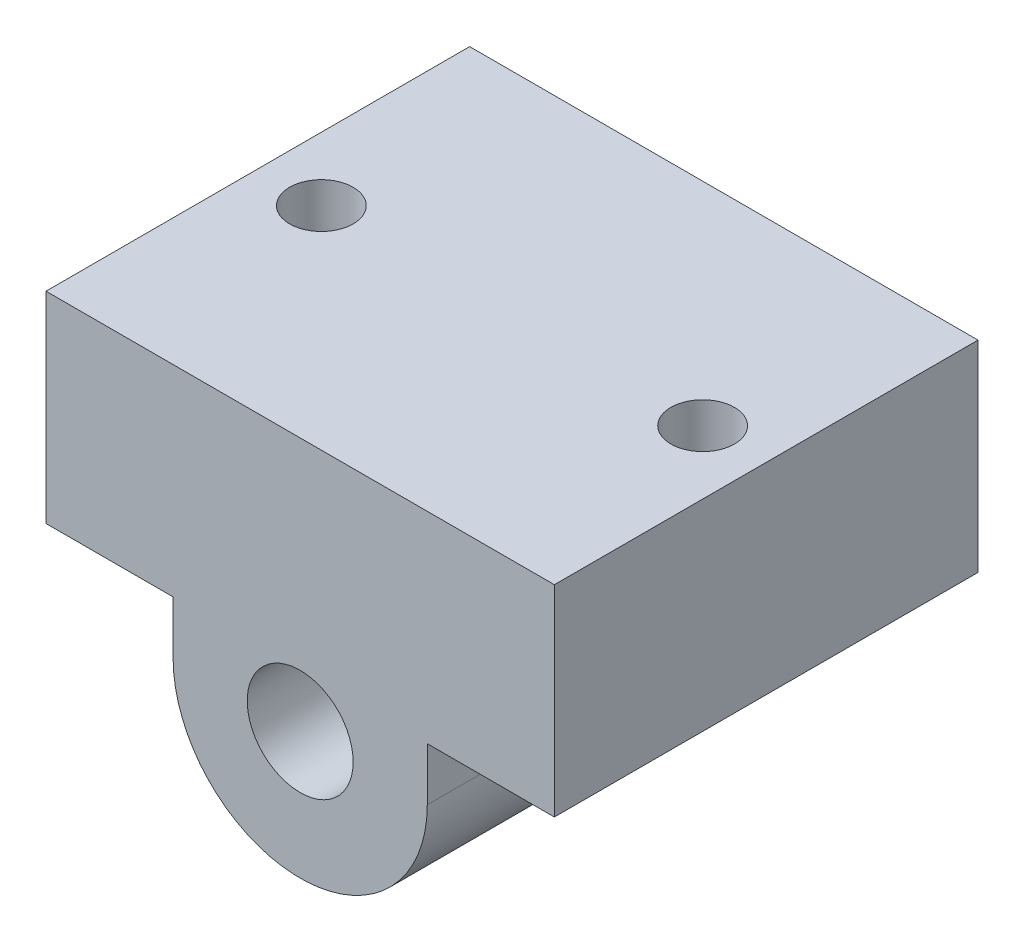
ISO-10303-21;
HEADER;
FILE_DESCRIPTION(('STEP AP214'),'2;1');
FILE_NAME('part.step','',(''),(''),'','','');
FILE_SCHEMA(('AUTOMOTIVE_DESIGN { 1 0 10303 214 1 1 1 1 }'));
ENDSEC;
DATA;
#1=APPLICATION_CONTEXT('core data for automotive mechanical design processes');
#2=APPLICATION_PROTOCOL_DEFINITION('international standard','automotive_design',2000,#1);
#3=PRODUCT_CONTEXT('',#1,'mechanical');
#4=PRODUCT('Part','Part','',(#3));
#5=PRODUCT_RELATED_PRODUCT_CATEGORY('part','',(#4));
#6=PRODUCT_DEFINITION_FORMATION('','',#4);
#7=PRODUCT_DEFINITION_CONTEXT('part definition',#1,'design');
#8=PRODUCT_DEFINITION('design','',#6,#7);
#9=PRODUCT_DEFINITION_SHAPE('','',#8);
#10=(LENGTH_UNIT() NAMED_UNIT(*) SI_UNIT(.MILLI.,.METRE.));
#11=(NAMED_UNIT(*) PLANE_ANGLE_UNIT() SI_UNIT($,.RADIAN.));
#12=(NAMED_UNIT(*) SI_UNIT($,.STERADIAN.) SOLID_ANGLE_UNIT());
#13=UNCERTAINTY_MEASURE_WITH_UNIT(LENGTH_MEASURE(1.E-05),#10,'distance_accuracy_value','');
#14=(GEOMETRIC_REPRESENTATION_CONTEXT(3) GLOBAL_UNCERTAINTY_ASSIGNED_CONTEXT((#13)) GLOBAL_UNIT_ASSIGNED_CONTEXT((#10,
#11,#12)) REPRESENTATION_CONTEXT('',''));
#15=CARTESIAN_POINT('',(0.,0.,0.));
#16=DIRECTION('',(0.,0.,1.));
#17=DIRECTION('',(1.,0.,0.));
#18=AXIS2_PLACEMENT_3D('',#15,#16,#17);
#19=CARTESIAN_POINT('',(0.,12.,-20.));
#20=DIRECTION('',(0.,-1.,0.));
#21=DIRECTION('',(0.,0.,-1.));
#22=AXIS2_PLACEMENT_3D('',#19,#20,#21);
#23=PLANE('',#22);
#24=CARTESIAN_POINT('',(-9.,12.,-10.));
#25=DIRECTION('',(0.,-1.,0.));
#26=DIRECTION('',(0.,0.,-1.));
#27=AXIS2_PLACEMENT_3D('',#24,#25,#26);
#28=CIRCLE('',#27,1.5);
#29=CARTESIAN_POINT('',(-9.,12.,-11.5));
#30=VERTEX_POINT('',#29);
#31=EDGE_CURVE('E199',#30,#30,#28,.T.);
#32=ORIENTED_EDGE('',*,*,#31,.T.);
#33=EDGE_LOOP('',(#32));
#34=FACE_BOUND('',#33,.T.);
#35=CARTESIAN_POINT('',(9.,12.,-10.));
#36=DIRECTION('',(0.,-1.,0.));
#37=DIRECTION('',(0.,0.,-1.));
#38=AXIS2_PLACEMENT_3D('',#35,#36,#37);
#39=CIRCLE('',#38,1.5);
#40=CARTESIAN_POINT('',(9.,12.,-11.5));
#41=VERTEX_POINT('',#40);
#42=EDGE_CURVE('E196',#41,#41,#39,.T.);
#43=ORIENTED_EDGE('',*,*,#42,.T.);
#44=EDGE_LOOP('',(#43));
#45=FACE_BOUND('',#44,.T.);
#46=DIRECTION('',(1.,0.,0.));
#47=VECTOR('',#46,1.);
#48=CARTESIAN_POINT('',(0.,12.,0.));
#49=LINE('',#48,#47);
#50=CARTESIAN_POINT('',(-12.,12.,0.));
#51=VERTEX_POINT('',#50);
#52=CARTESIAN_POINT('',(12.,12.,0.));
#53=VERTEX_POINT('',#52);
#54=EDGE_CURVE('E172',#51,#53,#49,.T.);
#55=ORIENTED_EDGE('',*,*,#54,.T.);
#56=DIRECTION('',(0.,0.,1.));
#57=VECTOR('',#56,1.);
#58=CARTESIAN_POINT('',(12.,12.,-20.));
#59=LINE('',#58,#57);
#60=CARTESIAN_POINT('',(12.,12.,-20.));
#61=VERTEX_POINT('',#60);
#62=EDGE_CURVE('E148',#61,#53,#59,.T.);
#63=ORIENTED_EDGE('',*,*,#62,.F.);
#64=DIRECTION('',(1.,0.,0.));
#65=VECTOR('',#64,1.);
#66=CARTESIAN_POINT('',(0.,12.,-20.));
#67=LINE('',#66,#65);
#68=CARTESIAN_POINT('',(-12.,12.,-20.));
#69=VERTEX_POINT('',#68);
#70=EDGE_CURVE('E217',#69,#61,#67,.T.);
#71=ORIENTED_EDGE('',*,*,#70,.F.);
#72=DIRECTION('',(0.,0.,1.));
#73=VECTOR('',#72,1.);
#74=CARTESIAN_POINT('',(-12.,12.,-20.));
#75=LINE('',#74,#73);
#76=EDGE_CURVE('E187',#69,#51,#75,.T.);
#77=ORIENTED_EDGE('',*,*,#76,.T.);
#78=EDGE_LOOP('',(#55,#63,#71,#77));
#79=FACE_BOUND('',#78,.T.);
#80=ADVANCED_FACE('F139',(#34,#45,#79),#23,.F.);
#81=CARTESIAN_POINT('',(0.,2.5,-20.));
#82=DIRECTION('',(0.,-1.,0.));
#83=DIRECTION('',(0.,0.,-1.));
#84=AXIS2_PLACEMENT_3D('',#81,#82,#83);
#85=PLANE('',#84);
#86=CARTESIAN_POINT('',(9.,2.5,-10.));
#87=DIRECTION('',(0.,-1.,0.));
#88=DIRECTION('',(0.,0.,-1.));
#89=AXIS2_PLACEMENT_3D('',#86,#87,#88);
#90=CIRCLE('',#89,1.5);
#91=CARTESIAN_POINT('',(9.,2.5,-11.5));
#92=VERTEX_POINT('',#91);
#93=EDGE_CURVE('E260',#92,#92,#90,.T.);
#94=ORIENTED_EDGE('',*,*,#93,.F.);
#95=EDGE_LOOP('',(#94));
#96=FACE_BOUND('',#95,.T.);
#97=DIRECTION('',(1.,0.,0.));
#98=VECTOR('',#97,1.);
#99=CARTESIAN_POINT('',(0.,2.5,0.));
#100=LINE('',#99,#98);
#101=CARTESIAN_POINT('',(6.,2.5,0.));
#102=VERTEX_POINT('',#101);
#103=CARTESIAN_POINT('',(12.,2.5,0.));
#104=VERTEX_POINT('',#103);
#105=EDGE_CURVE('E232',#102,#104,#100,.T.);
#106=ORIENTED_EDGE('',*,*,#105,.F.);
#107=DIRECTION('',(0.,0.,1.));
#108=VECTOR('',#107,1.);
#109=CARTESIAN_POINT('',(6.,2.5,-20.));
#110=LINE('',#109,#108);
#111=CARTESIAN_POINT('',(6.,2.5,-20.));
#112=VERTEX_POINT('',#111);
#113=EDGE_CURVE('E220',#112,#102,#110,.T.);
#114=ORIENTED_EDGE('',*,*,#113,.F.);
#115=DIRECTION('',(1.,0.,0.));
#116=VECTOR('',#115,1.);
#117=CARTESIAN_POINT('',(0.,2.5,-20.));
#118=LINE('',#117,#116);
#119=CARTESIAN_POINT('',(12.,2.5,-20.));
#120=VERTEX_POINT('',#119);
#121=EDGE_CURVE('E247',#112,#120,#118,.T.);
#122=ORIENTED_EDGE('',*,*,#121,.T.);
#123=DIRECTION('',(0.,0.,1.));
#124=VECTOR('',#123,1.);
#125=CARTESIAN_POINT('',(12.,2.5,-20.));
#126=LINE('',#125,#124);
#127=EDGE_CURVE('E223',#120,#104,#126,.T.);
#128=ORIENTED_EDGE('',*,*,#127,.T.);
#129=EDGE_LOOP('',(#106,#114,#122,#128));
#130=FACE_BOUND('',#129,.T.);
#131=ADVANCED_FACE('F280',(#96,#130),#85,.T.);
#132=CARTESIAN_POINT('',(12.,0.,-20.));
#133=DIRECTION('',(1.,0.,0.));
#134=DIRECTION('',(0.,0.,-1.));
#135=AXIS2_PLACEMENT_3D('',#132,#133,#134);
#136=PLANE('',#135);
#137=DIRECTION('',(0.,1.,0.));
#138=VECTOR('',#137,1.);
#139=CARTESIAN_POINT('',(12.,0.,0.));
#140=LINE('',#139,#138);
#141=EDGE_CURVE('E230',#104,#53,#140,.T.);
#142=ORIENTED_EDGE('',*,*,#141,.F.);
#143=ORIENTED_EDGE('',*,*,#127,.F.);
#144=DIRECTION('',(0.,1.,0.));
#145=VECTOR('',#144,1.);
#146=CARTESIAN_POINT('',(12.,0.,-20.));
#147=LINE('',#146,#145);
#148=EDGE_CURVE('E244',#120,#61,#147,.T.);
#149=ORIENTED_EDGE('',*,*,#148,.T.);
#150=ORIENTED_EDGE('',*,*,#62,.T.);
#151=EDGE_LOOP('',(#142,#143,#149,#150));
#152=FACE_BOUND('',#151,.T.);
#153=ADVANCED_FACE('F277',(#152),#136,.T.);
#154=CARTESIAN_POINT('',(6.,0.,-20.));
#155=DIRECTION('',(-1.,0.,0.));
#156=DIRECTION('',(0.,0.,1.));
#157=AXIS2_PLACEMENT_3D('',#154,#155,#156);
#158=PLANE('',#157);
#159=DIRECTION('',(0.,-1.,0.));
#160=VECTOR('',#159,1.);
#161=CARTESIAN_POINT('',(6.,0.,0.));
#162=LINE('',#161,#160);
#163=CARTESIAN_POINT('',(6.,0.,0.));
#164=VERTEX_POINT('',#163);
#165=EDGE_CURVE('E235',#102,#164,#162,.T.);
#166=ORIENTED_EDGE('',*,*,#165,.T.);
#167=DIRECTION('',(0.,0.,1.));
#168=VECTOR('',#167,1.);
#169=CARTESIAN_POINT('',(6.,0.,-20.));
#170=LINE('',#169,#168);
#171=CARTESIAN_POINT('',(6.,0.,-20.));
#172=VERTEX_POINT('',#171);
#173=EDGE_CURVE('E216',#172,#164,#170,.T.);
#174=ORIENTED_EDGE('',*,*,#173,.F.);
#175=DIRECTION('',(0.,-1.,0.));
#176=VECTOR('',#175,1.);
#177=CARTESIAN_POINT('',(6.,0.,-20.));
#178=LINE('',#177,#176);
#179=EDGE_CURVE('E250',#112,#172,#178,.T.);
#180=ORIENTED_EDGE('',*,*,#179,.F.);
#181=ORIENTED_EDGE('',*,*,#113,.T.);
#182=EDGE_LOOP('',(#166,#174,#180,#181));
#183=FACE_BOUND('',#182,.T.);
#184=ADVANCED_FACE('F288',(#183),#158,.F.);
#185=CARTESIAN_POINT('',(0.,0.,-20.));
#186=DIRECTION('',(0.,0.,1.));
#187=DIRECTION('',(1.,0.,0.));
#188=AXIS2_PLACEMENT_3D('',#185,#186,#187);
#189=CYLINDRICAL_SURFACE('',#188,6.);
#190=CARTESIAN_POINT('',(0.,0.,0.));
#191=DIRECTION('',(0.,0.,1.));
#192=DIRECTION('',(1.,0.,0.));
#193=AXIS2_PLACEMENT_3D('',#190,#191,#192);
#194=CIRCLE('',#193,6.);
#195=CARTESIAN_POINT('',(-6.,0.,0.));
#196=VERTEX_POINT('',#195);
#197=EDGE_CURVE('E238',#196,#164,#194,.T.);
#198=ORIENTED_EDGE('',*,*,#197,.F.);
#199=DIRECTION('',(0.,0.,1.));
#200=VECTOR('',#199,1.);
#201=CARTESIAN_POINT('',(-6.,0.,-20.));
#202=LINE('',#201,#200);
#203=CARTESIAN_POINT('',(-6.,0.,-20.));
#204=VERTEX_POINT('',#203);
#205=EDGE_CURVE('E213',#204,#196,#202,.T.);
#206=ORIENTED_EDGE('',*,*,#205,.F.);
#207=CARTESIAN_POINT('',(0.,0.,-20.));
#208=DIRECTION('',(0.,0.,1.));
#209=DIRECTION('',(1.,0.,0.));
#210=AXIS2_PLACEMENT_3D('',#207,#208,#209);
#211=CIRCLE('',#210,6.);
#212=EDGE_CURVE('E253',#204,#172,#211,.T.);
#213=ORIENTED_EDGE('',*,*,#212,.T.);
#214=ORIENTED_EDGE('',*,*,#173,.T.);
#215=EDGE_LOOP('',(#198,#206,#213,#214));
#216=FACE_BOUND('',#215,.T.);
#217=ADVANCED_FACE('F298',(#216),#189,.T.);
#218=CARTESIAN_POINT('',(-6.,0.,-20.));
#219=DIRECTION('',(1.,0.,0.));
#220=DIRECTION('',(0.,0.,-1.));
#221=AXIS2_PLACEMENT_3D('',#218,#219,#220);
#222=PLANE('',#221);
#223=DIRECTION('',(0.,1.,0.));
#224=VECTOR('',#223,1.);
#225=CARTESIAN_POINT('',(-6.,0.,0.));
#226=LINE('',#225,#224);
#227=CARTESIAN_POINT('',(-6.,2.5,0.));
#228=VERTEX_POINT('',#227);
#229=EDGE_CURVE('E212',#196,#228,#226,.T.);
#230=ORIENTED_EDGE('',*,*,#229,.T.);
#231=DIRECTION('',(0.,0.,-1.));
#232=VECTOR('',#231,1.);
#233=CARTESIAN_POINT('',(-6.,2.5,-20.));
#234=LINE('',#233,#232);
#235=CARTESIAN_POINT('',(-6.,2.5,-20.));
#236=VERTEX_POINT('',#235);
#237=EDGE_CURVE('E12',#228,#236,#234,.T.);
#238=ORIENTED_EDGE('',*,*,#237,.T.);
#239=DIRECTION('',(0.,1.,0.));
#240=VECTOR('',#239,1.);
#241=CARTESIAN_POINT('',(-6.,0.,-20.));
#242=LINE('',#241,#240);
#243=EDGE_CURVE('E229',#204,#236,#242,.T.);
#244=ORIENTED_EDGE('',*,*,#243,.F.);
#245=ORIENTED_EDGE('',*,*,#205,.T.);
#246=EDGE_LOOP('',(#230,#238,#244,#245));
#247=FACE_BOUND('',#246,.T.);
#248=ADVANCED_FACE('F302',(#247),#222,.F.);
#249=CARTESIAN_POINT('',(0.,0.,0.));
#250=DIRECTION('',(0.,0.,1.));
#251=DIRECTION('',(1.,0.,0.));
#252=AXIS2_PLACEMENT_3D('',#249,#250,#251);
#253=PLANE('',#252);
#254=CARTESIAN_POINT('',(0.,0.,0.));
#255=DIRECTION('',(0.,0.,1.));
#256=DIRECTION('',(1.,0.,0.));
#257=AXIS2_PLACEMENT_3D('',#254,#255,#256);
#258=CIRCLE('',#257,2.5);
#259=CARTESIAN_POINT('',(2.5,0.,0.));
#260=VERTEX_POINT('',#259);
#261=EDGE_CURVE('E186',#260,#260,#258,.T.);
#262=ORIENTED_EDGE('',*,*,#261,.F.);
#263=EDGE_LOOP('',(#262));
#264=FACE_BOUND('',#263,.T.);
#265=ORIENTED_EDGE('',*,*,#165,.F.);
#266=ORIENTED_EDGE('',*,*,#105,.T.);
#267=ORIENTED_EDGE('',*,*,#141,.T.);
#268=ORIENTED_EDGE('',*,*,#54,.F.);
#269=DIRECTION('',(0.,-1.,0.));
#270=VECTOR('',#269,1.);
#271=CARTESIAN_POINT('',(-12.,12.,0.));
#272=LINE('',#271,#270);
#273=CARTESIAN_POINT('',(-12.,2.5,0.));
#274=VERTEX_POINT('',#273);
#275=EDGE_CURVE('E181',#51,#274,#272,.T.);
#276=ORIENTED_EDGE('',*,*,#275,.T.);
#277=DIRECTION('',(1.,0.,0.));
#278=VECTOR('',#277,1.);
#279=CARTESIAN_POINT('',(-12.,2.5,0.));
#280=LINE('',#279,#278);
#281=EDGE_CURVE('E190',#274,#228,#280,.T.);
#282=ORIENTED_EDGE('',*,*,#281,.T.);
#283=ORIENTED_EDGE('',*,*,#229,.F.);
#284=ORIENTED_EDGE('',*,*,#197,.T.);
#285=EDGE_LOOP('',(#265,#266,#267,#268,#276,#282,#283,#284));
#286=FACE_BOUND('',#285,.T.);
#287=ADVANCED_FACE('F195',(#264,#286),#253,.T.);
#288=CARTESIAN_POINT('',(0.,0.,-20.));
#289=DIRECTION('',(0.,0.,1.));
#290=DIRECTION('',(1.,0.,0.));
#291=AXIS2_PLACEMENT_3D('',#288,#289,#290);
#292=PLANE('',#291);
#293=CARTESIAN_POINT('',(0.,0.,-20.));
#294=DIRECTION('',(0.,0.,1.));
#295=DIRECTION('',(1.,0.,0.));
#296=AXIS2_PLACEMENT_3D('',#293,#294,#295);
#297=CIRCLE('',#296,2.5);
#298=CARTESIAN_POINT('',(2.5,0.,-20.));
#299=VERTEX_POINT('',#298);
#300=EDGE_CURVE('E209',#299,#299,#297,.T.);
#301=ORIENTED_EDGE('',*,*,#300,.T.);
#302=EDGE_LOOP('',(#301));
#303=FACE_BOUND('',#302,.T.);
#304=ORIENTED_EDGE('',*,*,#121,.F.);
#305=ORIENTED_EDGE('',*,*,#179,.T.);
#306=ORIENTED_EDGE('',*,*,#212,.F.);
#307=ORIENTED_EDGE('',*,*,#243,.T.);
#308=DIRECTION('',(1.,0.,0.));
#309=VECTOR('',#308,1.);
#310=CARTESIAN_POINT('',(-12.,2.5,-20.));
#311=LINE('',#310,#309);
#312=CARTESIAN_POINT('',(-12.,2.5,-20.));
#313=VERTEX_POINT('',#312);
#314=EDGE_CURVE('E202',#313,#236,#311,.T.);
#315=ORIENTED_EDGE('',*,*,#314,.F.);
#316=DIRECTION('',(0.,-1.,0.));
#317=VECTOR('',#316,1.);
#318=CARTESIAN_POINT('',(-12.,12.,-20.));
#319=LINE('',#318,#317);
#320=EDGE_CURVE('E183',#69,#313,#319,.T.);
#321=ORIENTED_EDGE('',*,*,#320,.F.);
#322=ORIENTED_EDGE('',*,*,#70,.T.);
#323=ORIENTED_EDGE('',*,*,#148,.F.);
#324=EDGE_LOOP('',(#304,#305,#306,#307,#315,#321,#322,#323));
#325=FACE_BOUND('',#324,.T.);
#326=ADVANCED_FACE('F306',(#303,#325),#292,.F.);
#327=CARTESIAN_POINT('',(0.,0.,-20.));
#328=DIRECTION('',(0.,0.,1.));
#329=DIRECTION('',(1.,0.,0.));
#330=AXIS2_PLACEMENT_3D('',#327,#328,#329);
#331=CYLINDRICAL_SURFACE('',#330,2.5);
#332=ORIENTED_EDGE('',*,*,#300,.F.);
#333=EDGE_LOOP('',(#332));
#334=FACE_BOUND('',#333,.T.);
#335=ORIENTED_EDGE('',*,*,#261,.T.);
#336=EDGE_LOOP('',(#335));
#337=FACE_BOUND('',#336,.T.);
#338=ADVANCED_FACE('F276',(#334,#337),#331,.F.);
#339=CARTESIAN_POINT('',(-12.,12.,-20.));
#340=DIRECTION('',(-1.,0.,0.));
#341=DIRECTION('',(0.,-1.,0.));
#342=AXIS2_PLACEMENT_3D('',#339,#340,#341);
#343=PLANE('',#342);
#344=ORIENTED_EDGE('',*,*,#275,.F.);
#345=ORIENTED_EDGE('',*,*,#76,.F.);
#346=ORIENTED_EDGE('',*,*,#320,.T.);
#347=DIRECTION('',(0.,0.,1.));
#348=VECTOR('',#347,1.);
#349=CARTESIAN_POINT('',(-12.,2.5,-20.));
#350=LINE('',#349,#348);
#351=EDGE_CURVE('E178',#313,#274,#350,.T.);
#352=ORIENTED_EDGE('',*,*,#351,.T.);
#353=EDGE_LOOP('',(#344,#345,#346,#352));
#354=FACE_BOUND('',#353,.T.);
#355=ADVANCED_FACE('F141',(#354),#343,.T.);
#356=CARTESIAN_POINT('',(-12.,2.5,-20.));
#357=DIRECTION('',(0.,-1.,0.));
#358=DIRECTION('',(0.,0.,-1.));
#359=AXIS2_PLACEMENT_3D('',#356,#357,#358);
#360=PLANE('',#359);
#361=CARTESIAN_POINT('',(-9.,2.5,-10.));
#362=DIRECTION('',(0.,-1.,0.));
#363=DIRECTION('',(0.,0.,-1.));
#364=AXIS2_PLACEMENT_3D('',#361,#362,#363);
#365=CIRCLE('',#364,1.5);
#366=CARTESIAN_POINT('',(-9.,2.5,-11.5));
#367=VERTEX_POINT('',#366);
#368=EDGE_CURVE('E259',#367,#367,#365,.T.);
#369=ORIENTED_EDGE('',*,*,#368,.F.);
#370=EDGE_LOOP('',(#369));
#371=FACE_BOUND('',#370,.T.);
#372=ORIENTED_EDGE('',*,*,#237,.F.);
#373=ORIENTED_EDGE('',*,*,#281,.F.);
#374=ORIENTED_EDGE('',*,*,#351,.F.);
#375=ORIENTED_EDGE('',*,*,#314,.T.);
#376=EDGE_LOOP('',(#372,#373,#374,#375));
#377=FACE_BOUND('',#376,.T.);
#378=ADVANCED_FACE('F191',(#371,#377),#360,.T.);
#379=CARTESIAN_POINT('',(-9.,12.5,-10.));
#380=DIRECTION('',(0.,-1.,0.));
#381=DIRECTION('',(0.,0.,-1.));
#382=AXIS2_PLACEMENT_3D('',#379,#380,#381);
#383=CYLINDRICAL_SURFACE('',#382,1.5);
#384=ORIENTED_EDGE('',*,*,#368,.T.);
#385=EDGE_LOOP('',(#384));
#386=FACE_BOUND('',#385,.T.);
#387=ORIENTED_EDGE('',*,*,#31,.F.);
#388=EDGE_LOOP('',(#387));
#389=FACE_BOUND('',#388,.T.);
#390=ADVANCED_FACE('F266',(#386,#389),#383,.F.);
#391=CARTESIAN_POINT('',(9.,12.5,-10.));
#392=DIRECTION('',(0.,-1.,0.));
#393=DIRECTION('',(0.,0.,-1.));
#394=AXIS2_PLACEMENT_3D('',#391,#392,#393);
#395=CYLINDRICAL_SURFACE('',#394,1.5);
#396=ORIENTED_EDGE('',*,*,#93,.T.);
#397=EDGE_LOOP('',(#396));
#398=FACE_BOUND('',#397,.T.);
#399=ORIENTED_EDGE('',*,*,#42,.F.);
#400=EDGE_LOOP('',(#399));
#401=FACE_BOUND('',#400,.T.);
#402=ADVANCED_FACE('F274',(#398,#401),#395,.F.);
#403=CLOSED_SHELL('',(#80,#131,#153,#184,#217,#248,#287,#326,#338,#355,#378,#390,#402));
#404=MANIFOLD_SOLID_BREP('B2',#403);
#405=ADVANCED_BREP_SHAPE_REPRESENTATION('',(#18,#404),#14);
#406=SHAPE_DEFINITION_REPRESENTATION(#9,#405);
ENDSEC;
END-ISO-10303-21;
